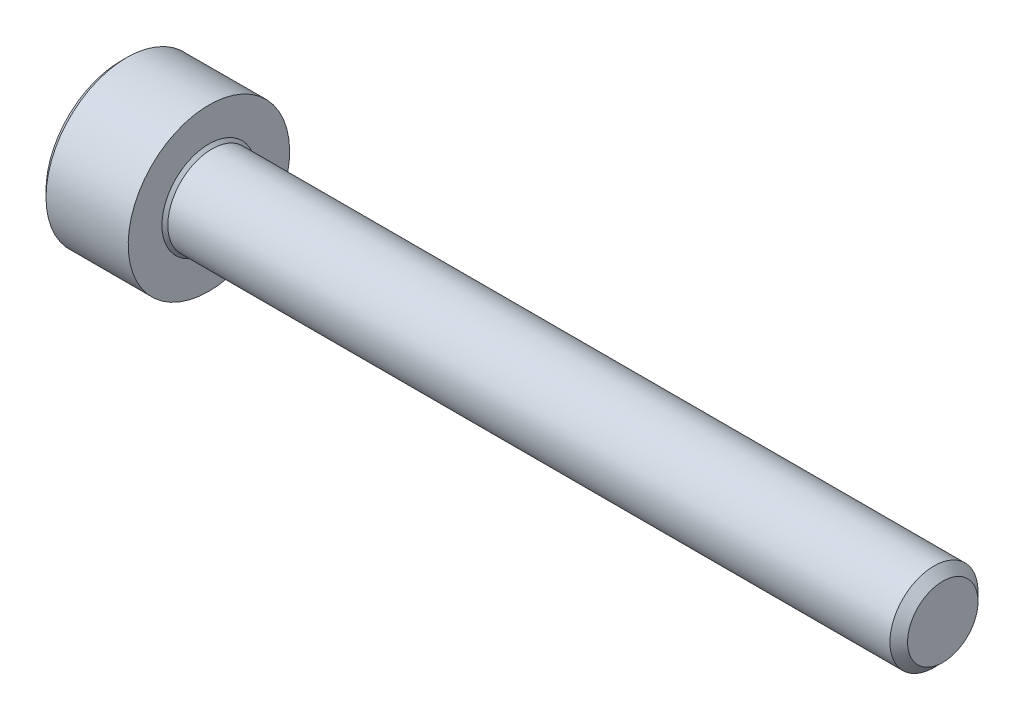
ISO-10303-21;
HEADER;
FILE_DESCRIPTION(('STEP AP214'),'2;1');
FILE_NAME('part.step','',(''),(''),'','','');
FILE_SCHEMA(('AUTOMOTIVE_DESIGN { 1 0 10303 214 1 1 1 1 }'));
ENDSEC;
DATA;
#1=APPLICATION_CONTEXT('core data for automotive mechanical design processes');
#2=APPLICATION_PROTOCOL_DEFINITION('international standard','automotive_design',2000,#1);
#3=PRODUCT_CONTEXT('',#1,'mechanical');
#4=PRODUCT('Part','Part','',(#3));
#5=PRODUCT_RELATED_PRODUCT_CATEGORY('part','',(#4));
#6=PRODUCT_DEFINITION_FORMATION('','',#4);
#7=PRODUCT_DEFINITION_CONTEXT('part definition',#1,'design');
#8=PRODUCT_DEFINITION('design','',#6,#7);
#9=PRODUCT_DEFINITION_SHAPE('','',#8);
#10=(LENGTH_UNIT() NAMED_UNIT(*) SI_UNIT(.MILLI.,.METRE.));
#11=(NAMED_UNIT(*) PLANE_ANGLE_UNIT() SI_UNIT($,.RADIAN.));
#12=(NAMED_UNIT(*) SI_UNIT($,.STERADIAN.) SOLID_ANGLE_UNIT());
#13=UNCERTAINTY_MEASURE_WITH_UNIT(LENGTH_MEASURE(1.E-05),#10,'distance_accuracy_value','');
#14=(GEOMETRIC_REPRESENTATION_CONTEXT(3) GLOBAL_UNCERTAINTY_ASSIGNED_CONTEXT((#13)) GLOBAL_UNIT_ASSIGNED_CONTEXT((#10,
#11,#12)) REPRESENTATION_CONTEXT('',''));
#15=CARTESIAN_POINT('',(0.,0.,0.));
#16=DIRECTION('',(0.,0.,1.));
#17=DIRECTION('',(1.,0.,0.));
#18=AXIS2_PLACEMENT_3D('',#15,#16,#17);
#19=CARTESIAN_POINT('',(-25.,0.,0.));
#20=DIRECTION('',(1.,0.,0.));
#21=DIRECTION('',(0.,0.,-1.));
#22=AXIS2_PLACEMENT_3D('',#19,#20,#21);
#23=CYLINDRICAL_SURFACE('',#22,1.5);
#24=CARTESIAN_POINT('',(-24.9,0.,0.));
#25=DIRECTION('',(-1.,0.,0.));
#26=DIRECTION('',(0.,0.,1.));
#27=AXIS2_PLACEMENT_3D('',#24,#25,#26);
#28=CIRCLE('',#27,1.5);
#29=CARTESIAN_POINT('',(-24.9,0.,1.5));
#30=VERTEX_POINT('',#29);
#31=EDGE_CURVE('E55',#30,#30,#28,.F.);
#32=ORIENTED_EDGE('',*,*,#31,.T.);
#33=EDGE_LOOP('',(#32));
#34=FACE_BOUND('',#33,.T.);
#35=CARTESIAN_POINT('',(-0.300000000000002,0.,0.));
#36=DIRECTION('',(1.,0.,0.));
#37=DIRECTION('',(0.,0.,-1.));
#38=AXIS2_PLACEMENT_3D('',#35,#36,#37);
#39=CIRCLE('',#38,1.5);
#40=CARTESIAN_POINT('',(-0.300000000000002,0.,-1.5));
#41=VERTEX_POINT('',#40);
#42=EDGE_CURVE('E108',#41,#41,#39,.F.);
#43=ORIENTED_EDGE('',*,*,#42,.T.);
#44=EDGE_LOOP('',(#43));
#45=FACE_BOUND('',#44,.T.);
#46=ADVANCED_FACE('F45',(#34,#45),#23,.T.);
#47=CARTESIAN_POINT('',(0.,0.,0.));
#48=DIRECTION('',(1.,0.,0.));
#49=DIRECTION('',(0.,0.,-1.));
#50=AXIS2_PLACEMENT_3D('',#47,#48,#49);
#51=PLANE('',#50);
#52=CARTESIAN_POINT('',(0.,0.,0.));
#53=DIRECTION('',(1.,0.,0.));
#54=DIRECTION('',(0.,0.,-1.));
#55=AXIS2_PLACEMENT_3D('',#52,#53,#54);
#56=CIRCLE('',#55,1.2);
#57=CARTESIAN_POINT('',(0.,0.,-1.2));
#58=VERTEX_POINT('',#57);
#59=EDGE_CURVE('E141',#58,#58,#56,.T.);
#60=ORIENTED_EDGE('',*,*,#59,.T.);
#61=EDGE_LOOP('',(#60));
#62=FACE_BOUND('',#61,.T.);
#63=ADVANCED_FACE('F220',(#62),#51,.T.);
#64=CARTESIAN_POINT('',(0.,0.,0.));
#65=DIRECTION('',(-1.,0.,0.));
#66=DIRECTION('',(0.,0.,1.));
#67=AXIS2_PLACEMENT_3D('',#64,#65,#66);
#68=CONICAL_SURFACE('',#67,1.2,0.785398163397452);
#69=ORIENTED_EDGE('',*,*,#42,.F.);
#70=EDGE_LOOP('',(#69));
#71=FACE_BOUND('',#70,.T.);
#72=ORIENTED_EDGE('',*,*,#59,.F.);
#73=EDGE_LOOP('',(#72));
#74=FACE_BOUND('',#73,.T.);
#75=ADVANCED_FACE('F228',(#71,#74),#68,.T.);
#76=CARTESIAN_POINT('',(-28.,0.,0.));
#77=DIRECTION('',(1.,0.,0.));
#78=DIRECTION('',(0.,1.,0.));
#79=AXIS2_PLACEMENT_3D('',#76,#77,#78);
#80=PLANE('',#79);
#81=CARTESIAN_POINT('',(-28.,0.,0.));
#82=DIRECTION('',(1.,0.,0.));
#83=DIRECTION('',(0.,1.,0.));
#84=AXIS2_PLACEMENT_3D('',#81,#82,#83);
#85=CIRCLE('',#84,2.55);
#86=CARTESIAN_POINT('',(-28.,2.55000000000001,0.));
#87=VERTEX_POINT('',#86);
#88=EDGE_CURVE('E107',#87,#87,#85,.F.);
#89=ORIENTED_EDGE('',*,*,#88,.T.);
#90=EDGE_LOOP('',(#89));
#91=FACE_BOUND('',#90,.T.);
#92=CARTESIAN_POINT('',(-28.,0.,0.));
#93=DIRECTION('',(-1.,0.,0.));
#94=DIRECTION('',(0.,-1.,0.));
#95=AXIS2_PLACEMENT_3D('',#92,#93,#94);
#96=CIRCLE('',#95,1.49337567297408);
#97=CARTESIAN_POINT('',(-28.,-1.493375672974,0.));
#98=VERTEX_POINT('',#97);
#99=EDGE_CURVE('E282',#98,#98,#96,.T.);
#100=ORIENTED_EDGE('',*,*,#99,.F.);
#101=EDGE_LOOP('',(#100));
#102=FACE_BOUND('',#101,.T.);
#103=ADVANCED_FACE('F236',(#91,#102),#80,.F.);
#104=CARTESIAN_POINT('',(-25.,0.,0.));
#105=DIRECTION('',(-1.,0.,0.));
#106=DIRECTION('',(0.,-1.,0.));
#107=AXIS2_PLACEMENT_3D('',#104,#105,#106);
#108=CYLINDRICAL_SURFACE('',#107,2.75);
#109=CARTESIAN_POINT('',(-27.8,0.,0.));
#110=DIRECTION('',(1.,0.,0.));
#111=DIRECTION('',(0.,1.,0.));
#112=AXIS2_PLACEMENT_3D('',#109,#110,#111);
#113=CIRCLE('',#112,2.75);
#114=CARTESIAN_POINT('',(-27.8,2.75,0.));
#115=VERTEX_POINT('',#114);
#116=EDGE_CURVE('E252',#115,#115,#113,.T.);
#117=ORIENTED_EDGE('',*,*,#116,.T.);
#118=EDGE_LOOP('',(#117));
#119=FACE_BOUND('',#118,.T.);
#120=CARTESIAN_POINT('',(-25.,0.,0.));
#121=DIRECTION('',(-1.,0.,0.));
#122=DIRECTION('',(0.,-1.,0.));
#123=AXIS2_PLACEMENT_3D('',#120,#121,#122);
#124=CIRCLE('',#123,2.75);
#125=CARTESIAN_POINT('',(-25.,-2.75,0.));
#126=VERTEX_POINT('',#125);
#127=EDGE_CURVE('E138',#126,#126,#124,.T.);
#128=ORIENTED_EDGE('',*,*,#127,.T.);
#129=EDGE_LOOP('',(#128));
#130=FACE_BOUND('',#129,.T.);
#131=ADVANCED_FACE('F266',(#119,#130),#108,.T.);
#132=CARTESIAN_POINT('',(-25.,2.75,0.));
#133=DIRECTION('',(-1.,0.,0.));
#134=DIRECTION('',(0.,-1.,0.));
#135=AXIS2_PLACEMENT_3D('',#132,#133,#134);
#136=PLANE('',#135);
#137=CARTESIAN_POINT('',(-25.,0.,0.));
#138=DIRECTION('',(-1.,0.,0.));
#139=DIRECTION('',(0.,-1.,0.));
#140=AXIS2_PLACEMENT_3D('',#137,#138,#139);
#141=CIRCLE('',#140,1.60000000000001);
#142=CARTESIAN_POINT('',(-25.,-1.60000000000002,0.));
#143=VERTEX_POINT('',#142);
#144=EDGE_CURVE('E11',#143,#143,#141,.T.);
#145=ORIENTED_EDGE('',*,*,#144,.T.);
#146=EDGE_LOOP('',(#145));
#147=FACE_BOUND('',#146,.T.);
#148=ORIENTED_EDGE('',*,*,#127,.F.);
#149=EDGE_LOOP('',(#148));
#150=FACE_BOUND('',#149,.T.);
#151=ADVANCED_FACE('F162',(#147,#150),#136,.F.);
#152=CARTESIAN_POINT('',(-28.,0.,0.));
#153=DIRECTION('',(-1.,0.,0.));
#154=DIRECTION('',(0.,-1.,0.));
#155=AXIS2_PLACEMENT_3D('',#152,#153,#154);
#156=CONICAL_SURFACE('',#155,1.49337567297408,0.78539816339745);
#157=ORIENTED_EDGE('',*,*,#99,.T.);
#158=EDGE_LOOP('',(#157));
#159=FACE_BOUND('',#158,.T.);
#160=CARTESIAN_POINT('',(-28.4014021689884,-1.42396736984794,1.25));
#161=CARTESIAN_POINT('',(-28.375296136448,-1.38922450814771,1.25));
#162=CARTESIAN_POINT('',(-28.3494506563431,-1.35428640192992,1.25));
#163=CARTESIAN_POINT('',(-28.2983879120234,-1.28394100441959,1.25));
#164=CARTESIAN_POINT('',(-28.2731708093588,-1.24853359598573,1.25));
#165=CARTESIAN_POINT('',(-28.1982633539511,-1.14097140016116,1.25));
#166=CARTESIAN_POINT('',(-28.1497190435972,-1.06800495826746,1.25));
#167=CARTESIAN_POINT('',(-28.0545600162985,-0.915095472420311,1.25));
#168=CARTESIAN_POINT('',(-28.0082030382604,-0.834990154954454,1.25));
#169=CARTESIAN_POINT('',(-27.9235039270025,-0.670798348959369,1.25));
#170=CARTESIAN_POINT('',(-27.8851347978723,-0.586726487937117,1.25));
#171=CARTESIAN_POINT('',(-27.8381985020476,-0.460385334768655,1.25));
#172=CARTESIAN_POINT('',(-27.8247021207698,-0.419954113336561,1.25));
#173=CARTESIAN_POINT('',(-27.8009573074475,-0.338129031291239,1.25));
#174=CARTESIAN_POINT('',(-27.7907091035293,-0.296735103284131,1.25));
#175=CARTESIAN_POINT('',(-27.7741594663553,-0.213916243687745,1.25));
#176=CARTESIAN_POINT('',(-27.7677913385525,-0.172504848949293,1.25));
#177=CARTESIAN_POINT('',(-27.7591237196608,-0.0892560954741499,1.25));
#178=CARTESIAN_POINT('',(-27.7568235599982,-0.0474188078702576,1.25));
#179=CARTESIAN_POINT('',(-27.7564564105193,0.0348235296905497,1.25));
#180=CARTESIAN_POINT('',(-27.7582455485416,0.0752279922917267,1.25));
#181=CARTESIAN_POINT('',(-27.7656448035135,0.155687005579656,1.25));
#182=CARTESIAN_POINT('',(-27.7712556629701,0.19574148673801,1.25));
#183=CARTESIAN_POINT('',(-27.7860898151071,0.275882483894718,1.25));
#184=CARTESIAN_POINT('',(-27.7953738895404,0.315957579678822,1.25));
#185=CARTESIAN_POINT('',(-27.8170656964992,0.39523402739533,1.25));
#186=CARTESIAN_POINT('',(-27.8294731489784,0.43443545731897,1.25));
#187=CARTESIAN_POINT('',(-27.8734108304631,0.558570325397169,1.25));
#188=CARTESIAN_POINT('',(-27.9099744143289,0.641718054005991,1.25));
#189=CARTESIAN_POINT('',(-27.9912478873066,0.804100725662132,1.25));
#190=CARTESIAN_POINT('',(-28.0359871895297,0.883320183915922,1.25));
#191=CARTESIAN_POINT('',(-28.1282652286461,1.03470895505827,1.25));
#192=CARTESIAN_POINT('',(-28.1755534388818,1.10703287925043,1.25));
#193=CARTESIAN_POINT('',(-28.2486463209253,1.21358798649196,1.25));
#194=CARTESIAN_POINT('',(-28.2732664432996,1.24864609054887,1.25));
#195=CARTESIAN_POINT('',(-28.323155260131,1.31828380805654,1.25));
#196=CARTESIAN_POINT('',(-28.3484237758017,1.35286354944699,1.25));
#197=CARTESIAN_POINT('',(-28.3739610581168,1.38724419886392,1.25));
#198=B_SPLINE_CURVE_WITH_KNOTS('',3,(#160,#161,#162,#163,#164,#165,#166,#167,#168,#169,#170,
#171,#172,#173,#174,#175,#176,#177,#178,#179,#180,#181,#182,#183,#184,#185,#186,#187,#188,#189,
#190,#191,#192,#193,#194,#195,#196,#197),.UNSPECIFIED.,.F.,.F.,(4,2,2,2,2,2,2,2,2,2,2,2,2,2,2,2,
2,2,4),(0.,0.130370422461749,0.260774023229279,0.523571931962183,0.800995227642795,
1.07746514553943,1.20522972687284,1.33300327939672,1.45851355132216,1.58400319361991,
1.70514602294322,1.82631239533598,1.94957373840993,2.07282403363807,2.34451838945523,
2.61721016161586,2.87631588769063,3.00482945023601,3.13330794967363),.UNSPECIFIED.);
#199=CARTESIAN_POINT('',(-27.95,-0.721687836486955,1.25));
#200=VERTEX_POINT('',#199);
#201=CARTESIAN_POINT('',(-27.95,0.72168783648711,1.25));
#202=VERTEX_POINT('',#201);
#203=EDGE_CURVE('E116',#200,#202,#198,.T.);
#204=ORIENTED_EDGE('',*,*,#203,.F.);
#205=CARTESIAN_POINT('',(-27.9501154839091,-1.44349114302782,-0.00019999999999968));
#206=CARTESIAN_POINT('',(-27.9253216680551,-1.41867941875057,0.0427751670715872));
#207=CARTESIAN_POINT('',(-27.9019837344187,-1.39345276980735,0.0864690047459481));
#208=CARTESIAN_POINT('',(-27.8592520040845,-1.34201263554186,0.175565930841942));
#209=CARTESIAN_POINT('',(-27.8398819923604,-1.31579425481269,0.220977498357064));
#210=CARTESIAN_POINT('',(-27.8067004834135,-1.26292610442238,0.31254782093526));
#211=CARTESIAN_POINT('',(-27.7928055590526,-1.23628980770463,0.358683240175886));
#212=CARTESIAN_POINT('',(-27.7713972821606,-1.18243062538501,0.451970080407592));
#213=CARTESIAN_POINT('',(-27.7638679415668,-1.15520938653754,0.499118649136379));
#214=CARTESIAN_POINT('',(-27.7570744980507,-1.10829684367459,0.580373556887252));
#215=CARTESIAN_POINT('',(-27.7560685591043,-1.0886661725695,0.61437487662794));
#216=CARTESIAN_POINT('',(-27.7577614149113,-1.04943932800603,0.682317764432477));
#217=CARTESIAN_POINT('',(-27.7604610272155,-1.02984316311592,0.716259317655657));
#218=CARTESIAN_POINT('',(-27.7694089303164,-0.990839954603422,0.783814856457499));
#219=CARTESIAN_POINT('',(-27.7756605258997,-0.971433104248694,0.817428507286774));
#220=CARTESIAN_POINT('',(-27.7913756814139,-0.932943395609829,0.884094638217812));
#221=CARTESIAN_POINT('',(-27.8008406200874,-0.913860680098224,0.917146871030295));
#222=CARTESIAN_POINT('',(-27.8289313906876,-0.864986351354491,1.00179969160026));
#223=CARTESIAN_POINT('',(-27.8496701574522,-0.835502920148999,1.05286649242964));
#224=CARTESIAN_POINT('',(-27.8963871346715,-0.777690319475831,1.15300085411325));
#225=CARTESIAN_POINT('',(-27.9223482959468,-0.749357745598339,1.20207431157827));
#226=CARTESIAN_POINT('',(-27.9501154839091,-0.721572366433117,1.2502));
#227=B_SPLINE_CURVE_WITH_KNOTS('',3,(#205,#206,#207,#208,#209,#210,#211,#212,#213,#214,#215,
#216,#217,#218,#219,#220,#221,#222,#223,#224,#225,#226),.UNSPECIFIED.,.F.,.F.,(4,2,2,2,2,2,2,2,
2,2,4),(0.,0.166533409618301,0.334037607289761,0.498880396489697,0.663307919240273,
0.780963963458825,0.898645970148451,1.01643764860773,1.13427993171549,1.32148652032141,
1.50809158792573),.UNSPECIFIED.);
#228=CARTESIAN_POINT('',(-27.95,-1.44337567297399,0.));
#229=VERTEX_POINT('',#228);
#230=EDGE_CURVE('E184',#229,#200,#227,.T.);
#231=ORIENTED_EDGE('',*,*,#230,.F.);
#232=CARTESIAN_POINT('',(-27.9501154839091,-0.721572366433116,-1.2502));
#233=CARTESIAN_POINT('',(-27.9253216680551,-0.746384090710366,-1.20722483292841));
#234=CARTESIAN_POINT('',(-27.9019837344187,-0.771610739653586,-1.16353099525405));
#235=CARTESIAN_POINT('',(-27.8592520040845,-0.823050873919077,-1.07443406915806));
#236=CARTESIAN_POINT('',(-27.8398819923604,-0.849269254648255,-1.02902250164294));
#237=CARTESIAN_POINT('',(-27.8067004834135,-0.902137405038558,-0.937452179064741));
#238=CARTESIAN_POINT('',(-27.7928055590526,-0.92877370175631,-0.891316759824115));
#239=CARTESIAN_POINT('',(-27.7713972821606,-0.982632884075936,-0.798029919592408));
#240=CARTESIAN_POINT('',(-27.7638679415668,-1.00985412292341,-0.75088135086362));
#241=CARTESIAN_POINT('',(-27.7570744980507,-1.05676666578635,-0.669626443112747));
#242=CARTESIAN_POINT('',(-27.7560685591043,-1.07639733689144,-0.635625123372058));
#243=CARTESIAN_POINT('',(-27.7577614149113,-1.11562418145491,-0.567682235567522));
#244=CARTESIAN_POINT('',(-27.7604610272155,-1.13522034634503,-0.533740682344342));
#245=CARTESIAN_POINT('',(-27.7694089303164,-1.17422355485752,-0.466185143542499));
#246=CARTESIAN_POINT('',(-27.7756605258997,-1.19363040521225,-0.432571492713224));
#247=CARTESIAN_POINT('',(-27.7913756814139,-1.23212011385111,-0.365905361782186));
#248=CARTESIAN_POINT('',(-27.8008406200874,-1.25120282936272,-0.332853128969703));
#249=CARTESIAN_POINT('',(-27.8289313906876,-1.30007715810645,-0.248200308399735));
#250=CARTESIAN_POINT('',(-27.8496701574522,-1.32956058931194,-0.197133507570361));
#251=CARTESIAN_POINT('',(-27.8963871346715,-1.38737318998511,-0.0969991458867458));
#252=CARTESIAN_POINT('',(-27.9223482959468,-1.4157057638626,-0.0479256884217315));
#253=CARTESIAN_POINT('',(-27.9501154839091,-1.44349114302782,0.000199999999999769));
#254=B_SPLINE_CURVE_WITH_KNOTS('',3,(#232,#233,#234,#235,#236,#237,#238,#239,#240,#241,#242,
#243,#244,#245,#246,#247,#248,#249,#250,#251,#252,#253),.UNSPECIFIED.,.F.,.F.,(4,2,2,2,2,2,2,2,
2,2,4),(0.,0.166533409618304,0.334037607289763,0.498880396489698,0.663307919240276,
0.780963963458829,0.898645970148455,1.01643764860774,1.1342799317155,1.32148652032141,
1.50809158792574),.UNSPECIFIED.);
#255=CARTESIAN_POINT('',(-27.95,-0.721687836486954,-1.25));
#256=VERTEX_POINT('',#255);
#257=EDGE_CURVE('E177',#256,#229,#254,.T.);
#258=ORIENTED_EDGE('',*,*,#257,.F.);
#259=CARTESIAN_POINT('',(-28.4014021689884,-1.42396736984794,-1.25));
#260=CARTESIAN_POINT('',(-28.375296136448,-1.3892245081477,-1.25));
#261=CARTESIAN_POINT('',(-28.3494506563431,-1.35428640192992,-1.25));
#262=CARTESIAN_POINT('',(-28.2983879120234,-1.28394100441958,-1.25));
#263=CARTESIAN_POINT('',(-28.2731708093588,-1.24853359598572,-1.25));
#264=CARTESIAN_POINT('',(-28.1982633539511,-1.14097140016115,-1.25));
#265=CARTESIAN_POINT('',(-28.1497190435972,-1.06800495826746,-1.25));
#266=CARTESIAN_POINT('',(-28.0545600162985,-0.91509547242031,-1.25));
#267=CARTESIAN_POINT('',(-28.0082030382604,-0.834990154954453,-1.25));
#268=CARTESIAN_POINT('',(-27.9235039270025,-0.670798348959368,-1.25));
#269=CARTESIAN_POINT('',(-27.8851347978723,-0.586726487937116,-1.25));
#270=CARTESIAN_POINT('',(-27.8381985020476,-0.460385334768654,-1.25));
#271=CARTESIAN_POINT('',(-27.8247021207698,-0.41995411333656,-1.25));
#272=CARTESIAN_POINT('',(-27.8009573074475,-0.338129031291238,-1.25));
#273=CARTESIAN_POINT('',(-27.7907091035293,-0.29673510328413,-1.25));
#274=CARTESIAN_POINT('',(-27.7741594663553,-0.213916243687744,-1.25));
#275=CARTESIAN_POINT('',(-27.7677913385525,-0.172504848949292,-1.25));
#276=CARTESIAN_POINT('',(-27.7591237196608,-0.0892560954741491,-1.25));
#277=CARTESIAN_POINT('',(-27.7568235599982,-0.0474188078702568,-1.25));
#278=CARTESIAN_POINT('',(-27.7564564105193,0.0348235296905505,-1.25));
#279=CARTESIAN_POINT('',(-27.7582455485416,0.0752279922917275,-1.25));
#280=CARTESIAN_POINT('',(-27.7656448035135,0.155687005579657,-1.25));
#281=CARTESIAN_POINT('',(-27.7712556629701,0.195741486738011,-1.25));
#282=CARTESIAN_POINT('',(-27.7860898151071,0.275882483894719,-1.25));
#283=CARTESIAN_POINT('',(-27.7953738895404,0.315957579678822,-1.25));
#284=CARTESIAN_POINT('',(-27.8170656964992,0.39523402739533,-1.25));
#285=CARTESIAN_POINT('',(-27.8294731489784,0.43443545731897,-1.25));
#286=CARTESIAN_POINT('',(-27.8734108304631,0.55857032539717,-1.25));
#287=CARTESIAN_POINT('',(-27.9099744143289,0.641718054005991,-1.25));
#288=CARTESIAN_POINT('',(-27.9912478873066,0.804100725662132,-1.25));
#289=CARTESIAN_POINT('',(-28.0359871895297,0.883320183915921,-1.25));
#290=CARTESIAN_POINT('',(-28.1282652286461,1.03470895505827,-1.25));
#291=CARTESIAN_POINT('',(-28.1755534388818,1.10703287925042,-1.25));
#292=CARTESIAN_POINT('',(-28.2486463209253,1.21358798649196,-1.25));
#293=CARTESIAN_POINT('',(-28.2732664432996,1.24864609054887,-1.25));
#294=CARTESIAN_POINT('',(-28.323155260131,1.31828380805654,-1.25));
#295=CARTESIAN_POINT('',(-28.3484237758017,1.35286354944699,-1.25));
#296=CARTESIAN_POINT('',(-28.3739610581168,1.38724419886392,-1.25));
#297=B_SPLINE_CURVE_WITH_KNOTS('',3,(#259,#260,#261,#262,#263,#264,#265,#266,#267,#268,#269,
#270,#271,#272,#273,#274,#275,#276,#277,#278,#279,#280,#281,#282,#283,#284,#285,#286,#287,#288,
#289,#290,#291,#292,#293,#294,#295,#296),.UNSPECIFIED.,.F.,.F.,(4,2,2,2,2,2,2,2,2,2,2,2,2,2,2,2,
2,2,4),(0.,0.130370422461749,0.26077402322928,0.523571931962182,0.800995227642794,
1.07746514553942,1.20522972687283,1.33300327939672,1.45851355132216,1.58400319361991,
1.70514602294322,1.82631239533598,1.94957373840993,2.07282403363807,2.34451838945522,
2.61721016161585,2.87631588769063,3.00482945023601,3.13330794967363),.UNSPECIFIED.);
#298=CARTESIAN_POINT('',(-27.95,0.721687836487111,-1.25));
#299=VERTEX_POINT('',#298);
#300=EDGE_CURVE('E62',#299,#256,#297,.F.);
#301=ORIENTED_EDGE('',*,*,#300,.F.);
#302=CARTESIAN_POINT('',(-27.9501154839091,1.44349114302798,0.000199999999999836));
#303=CARTESIAN_POINT('',(-27.9253216680551,1.41867941875073,-0.0427751670715866));
#304=CARTESIAN_POINT('',(-27.9019837344187,1.39345276980751,-0.0864690047459474));
#305=CARTESIAN_POINT('',(-27.8592520040845,1.34201263554202,-0.175565930841941));
#306=CARTESIAN_POINT('',(-27.8398819923604,1.31579425481284,-0.220977498357063));
#307=CARTESIAN_POINT('',(-27.8067004834135,1.26292610442254,-0.312547820935259));
#308=CARTESIAN_POINT('',(-27.7928055590526,1.23628980770479,-0.358683240175884));
#309=CARTESIAN_POINT('',(-27.7713972821606,1.18243062538516,-0.45197008040759));
#310=CARTESIAN_POINT('',(-27.7638679415668,1.15520938653769,-0.499118649136378));
#311=CARTESIAN_POINT('',(-27.7570744980507,1.10829684367475,-0.58037355688725));
#312=CARTESIAN_POINT('',(-27.7560685591043,1.08866617256966,-0.614374876627939));
#313=CARTESIAN_POINT('',(-27.7577614149113,1.04943932800619,-0.682317764432475));
#314=CARTESIAN_POINT('',(-27.7604610272155,1.02984316311607,-0.716259317655655));
#315=CARTESIAN_POINT('',(-27.7694089303164,0.990839954603578,-0.783814856457497));
#316=CARTESIAN_POINT('',(-27.7756605258997,0.97143310424885,-0.817428507286772));
#317=CARTESIAN_POINT('',(-27.7913756814139,0.932943395609984,-0.884094638217811));
#318=CARTESIAN_POINT('',(-27.8008406200874,0.91386068009838,-0.917146871030293));
#319=CARTESIAN_POINT('',(-27.8289313906876,0.864986351354647,-1.00179969160026));
#320=CARTESIAN_POINT('',(-27.8496701574522,0.835502920149155,-1.05286649242964));
#321=CARTESIAN_POINT('',(-27.8963871346715,0.777690319475987,-1.15300085411325));
#322=CARTESIAN_POINT('',(-27.9223482959467,0.749357745598495,-1.20207431157827));
#323=CARTESIAN_POINT('',(-27.9501154839091,0.721572366433273,-1.2502));
#324=B_SPLINE_CURVE_WITH_KNOTS('',3,(#302,#303,#304,#305,#306,#307,#308,#309,#310,#311,#312,
#313,#314,#315,#316,#317,#318,#319,#320,#321,#322,#323),.UNSPECIFIED.,.F.,.F.,(4,2,2,2,2,2,2,2,
2,2,4),(0.,0.166533409618301,0.33403760728976,0.498880396489695,0.663307919240271,
0.780963963458823,0.898645970148449,1.01643764860773,1.13427993171549,1.32148652032141,
1.50809158792573),.UNSPECIFIED.);
#325=CARTESIAN_POINT('',(-27.95,1.44337567297414,0.));
#326=VERTEX_POINT('',#325);
#327=EDGE_CURVE('E99',#326,#299,#324,.T.);
#328=ORIENTED_EDGE('',*,*,#327,.F.);
#329=CARTESIAN_POINT('',(-27.9501154839091,0.721572366433273,1.2502));
#330=CARTESIAN_POINT('',(-27.9253216680551,0.746384090710522,1.20722483292841));
#331=CARTESIAN_POINT('',(-27.9019837344187,0.771610739653742,1.16353099525405));
#332=CARTESIAN_POINT('',(-27.8592520040845,0.823050873919232,1.07443406915806));
#333=CARTESIAN_POINT('',(-27.8398819923604,0.849269254648411,1.02902250164294));
#334=CARTESIAN_POINT('',(-27.8067004834135,0.902137405038714,0.93745217906474));
#335=CARTESIAN_POINT('',(-27.7928055590526,0.928773701756465,0.891316759824114));
#336=CARTESIAN_POINT('',(-27.7713972821606,0.982632884076091,0.798029919592407));
#337=CARTESIAN_POINT('',(-27.7638679415668,1.00985412292356,0.75088135086362));
#338=CARTESIAN_POINT('',(-27.7570744980507,1.05676666578651,0.669626443112747));
#339=CARTESIAN_POINT('',(-27.7560685591043,1.0763973368916,0.635625123372059));
#340=CARTESIAN_POINT('',(-27.7577614149113,1.11562418145506,0.567682235567522));
#341=CARTESIAN_POINT('',(-27.7604610272155,1.13522034634518,0.533740682344342));
#342=CARTESIAN_POINT('',(-27.7694089303164,1.17422355485768,0.4661851435425));
#343=CARTESIAN_POINT('',(-27.7756605258997,1.1936304052124,0.432571492713225));
#344=CARTESIAN_POINT('',(-27.7913756814139,1.23212011385127,0.365905361782186));
#345=CARTESIAN_POINT('',(-27.8008406200874,1.25120282936287,0.332853128969704));
#346=CARTESIAN_POINT('',(-27.8289313906876,1.30007715810661,0.248200308399735));
#347=CARTESIAN_POINT('',(-27.8496701574522,1.3295605893121,0.197133507570362));
#348=CARTESIAN_POINT('',(-27.8963871346715,1.38737318998527,0.0969991458867465));
#349=CARTESIAN_POINT('',(-27.9223482959467,1.41570576386276,0.0479256884217325));
#350=CARTESIAN_POINT('',(-27.9501154839091,1.44349114302798,-0.000199999999998577));
#351=B_SPLINE_CURVE_WITH_KNOTS('',3,(#329,#330,#331,#332,#333,#334,#335,#336,#337,#338,#339,
#340,#341,#342,#343,#344,#345,#346,#347,#348,#349,#350),.UNSPECIFIED.,.F.,.F.,(4,2,2,2,2,2,2,2,
2,2,4),(0.,0.166533409618302,0.334037607289762,0.498880396489699,0.663307919240275,
0.780963963458827,0.898645970148453,1.01643764860773,1.13427993171549,1.32148652032141,
1.50809158792573),.UNSPECIFIED.);
#352=EDGE_CURVE('E102',#202,#326,#351,.T.);
#353=ORIENTED_EDGE('',*,*,#352,.F.);
#354=EDGE_LOOP('',(#204,#231,#258,#301,#328,#353));
#355=FACE_BOUND('',#354,.T.);
#356=ADVANCED_FACE('F101',(#159,#355),#156,.F.);
#357=CARTESIAN_POINT('',(-26.4,1.2849902020621E-13,0.));
#358=DIRECTION('',(-1.,0.,0.));
#359=DIRECTION('',(0.,-1.,0.));
#360=AXIS2_PLACEMENT_3D('',#357,#358,#359);
#361=PLANE('',#360);
#362=DIRECTION('',(0.,0.5,-0.866025403784439));
#363=VECTOR('',#362,1.);
#364=CARTESIAN_POINT('',(-26.4,0.721687836487105,1.25));
#365=LINE('',#364,#363);
#366=CARTESIAN_POINT('',(-26.4,0.721687836487105,1.25));
#367=VERTEX_POINT('',#366);
#368=CARTESIAN_POINT('',(-26.4,1.44337567297414,0.));
#369=VERTEX_POINT('',#368);
#370=EDGE_CURVE('E115',#367,#369,#365,.T.);
#371=ORIENTED_EDGE('',*,*,#370,.T.);
#372=DIRECTION('',(0.,-0.5,-0.866025403784439));
#373=VECTOR('',#372,1.);
#374=CARTESIAN_POINT('',(-26.4,1.44337567297414,0.));
#375=LINE('',#374,#373);
#376=CARTESIAN_POINT('',(-26.4,0.721687836487105,-1.25));
#377=VERTEX_POINT('',#376);
#378=EDGE_CURVE('E120',#369,#377,#375,.T.);
#379=ORIENTED_EDGE('',*,*,#378,.T.);
#380=DIRECTION('',(0.,-1.,0.));
#381=VECTOR('',#380,1.);
#382=CARTESIAN_POINT('',(-26.4,0.721687836487105,-1.25));
#383=LINE('',#382,#381);
#384=CARTESIAN_POINT('',(-26.4,-0.72168783648696,-1.25));
#385=VERTEX_POINT('',#384);
#386=EDGE_CURVE('E318',#377,#385,#383,.T.);
#387=ORIENTED_EDGE('',*,*,#386,.T.);
#388=DIRECTION('',(0.,-0.5,0.866025403784439));
#389=VECTOR('',#388,1.);
#390=CARTESIAN_POINT('',(-26.4,-0.72168783648696,-1.25));
#391=LINE('',#390,#389);
#392=CARTESIAN_POINT('',(-26.4,-1.44337567297399,0.));
#393=VERTEX_POINT('',#392);
#394=EDGE_CURVE('E315',#385,#393,#391,.T.);
#395=ORIENTED_EDGE('',*,*,#394,.T.);
#396=DIRECTION('',(0.,0.5,0.866025403784439));
#397=VECTOR('',#396,1.);
#398=CARTESIAN_POINT('',(-26.4,-1.44337567297399,0.));
#399=LINE('',#398,#397);
#400=CARTESIAN_POINT('',(-26.4,-0.721687836486961,1.25));
#401=VERTEX_POINT('',#400);
#402=EDGE_CURVE('E134',#393,#401,#399,.T.);
#403=ORIENTED_EDGE('',*,*,#402,.T.);
#404=DIRECTION('',(0.,1.,0.));
#405=VECTOR('',#404,1.);
#406=CARTESIAN_POINT('',(-26.4,-0.721687836486961,1.25));
#407=LINE('',#406,#405);
#408=EDGE_CURVE('E124',#401,#367,#407,.T.);
#409=ORIENTED_EDGE('',*,*,#408,.T.);
#410=EDGE_LOOP('',(#371,#379,#387,#395,#403,#409));
#411=FACE_BOUND('',#410,.T.);
#412=ADVANCED_FACE('F161',(#411),#361,.T.);
#413=CARTESIAN_POINT('',(-26.4,1.44337567297414,0.));
#414=DIRECTION('',(0.,0.866025403784439,-0.5));
#415=DIRECTION('',(0.,0.5,0.866025403784439));
#416=AXIS2_PLACEMENT_3D('',#413,#414,#415);
#417=PLANE('',#416);
#418=DIRECTION('',(-1.,0.,0.));
#419=VECTOR('',#418,1.);
#420=CARTESIAN_POINT('',(-26.4,1.44337567297414,0.));
#421=LINE('',#420,#419);
#422=EDGE_CURVE('E112',#369,#326,#421,.T.);
#423=ORIENTED_EDGE('',*,*,#422,.T.);
#424=ORIENTED_EDGE('',*,*,#327,.T.);
#425=DIRECTION('',(-1.,0.,0.));
#426=VECTOR('',#425,1.);
#427=CARTESIAN_POINT('',(-26.4,0.721687836487105,-1.25));
#428=LINE('',#427,#426);
#429=EDGE_CURVE('E123',#377,#299,#428,.T.);
#430=ORIENTED_EDGE('',*,*,#429,.F.);
#431=ORIENTED_EDGE('',*,*,#378,.F.);
#432=EDGE_LOOP('',(#423,#424,#430,#431));
#433=FACE_BOUND('',#432,.T.);
#434=ADVANCED_FACE('F118',(#433),#417,.F.);
#435=CARTESIAN_POINT('',(-26.4,0.721687836487105,-1.25));
#436=DIRECTION('',(0.,0.,-1.));
#437=DIRECTION('',(-1.,0.,0.));
#438=AXIS2_PLACEMENT_3D('',#435,#436,#437);
#439=PLANE('',#438);
#440=ORIENTED_EDGE('',*,*,#429,.T.);
#441=ORIENTED_EDGE('',*,*,#300,.T.);
#442=DIRECTION('',(-1.,0.,0.));
#443=VECTOR('',#442,1.);
#444=CARTESIAN_POINT('',(-26.4,-0.72168783648696,-1.25));
#445=LINE('',#444,#443);
#446=EDGE_CURVE('E130',#385,#256,#445,.T.);
#447=ORIENTED_EDGE('',*,*,#446,.F.);
#448=ORIENTED_EDGE('',*,*,#386,.F.);
#449=EDGE_LOOP('',(#440,#441,#447,#448));
#450=FACE_BOUND('',#449,.T.);
#451=ADVANCED_FACE('F211',(#450),#439,.F.);
#452=CARTESIAN_POINT('',(-26.4,-0.72168783648696,-1.25));
#453=DIRECTION('',(0.,-0.866025403784439,-0.5));
#454=DIRECTION('',(0.,0.5,-0.866025403784439));
#455=AXIS2_PLACEMENT_3D('',#452,#453,#454);
#456=PLANE('',#455);
#457=ORIENTED_EDGE('',*,*,#446,.T.);
#458=ORIENTED_EDGE('',*,*,#257,.T.);
#459=DIRECTION('',(-1.,0.,0.));
#460=VECTOR('',#459,1.);
#461=CARTESIAN_POINT('',(-26.4,-1.44337567297399,0.));
#462=LINE('',#461,#460);
#463=EDGE_CURVE('E300',#393,#229,#462,.T.);
#464=ORIENTED_EDGE('',*,*,#463,.F.);
#465=ORIENTED_EDGE('',*,*,#394,.F.);
#466=EDGE_LOOP('',(#457,#458,#464,#465));
#467=FACE_BOUND('',#466,.T.);
#468=ADVANCED_FACE('F207',(#467),#456,.F.);
#469=CARTESIAN_POINT('',(-26.4,-1.44337567297399,0.));
#470=DIRECTION('',(0.,-0.866025403784439,0.5));
#471=DIRECTION('',(0.,-0.5,-0.866025403784439));
#472=AXIS2_PLACEMENT_3D('',#469,#470,#471);
#473=PLANE('',#472);
#474=ORIENTED_EDGE('',*,*,#463,.T.);
#475=ORIENTED_EDGE('',*,*,#230,.T.);
#476=DIRECTION('',(-1.,0.,0.));
#477=VECTOR('',#476,1.);
#478=CARTESIAN_POINT('',(-26.4,-0.721687836486961,1.25));
#479=LINE('',#478,#477);
#480=EDGE_CURVE('E298',#401,#200,#479,.T.);
#481=ORIENTED_EDGE('',*,*,#480,.F.);
#482=ORIENTED_EDGE('',*,*,#402,.F.);
#483=EDGE_LOOP('',(#474,#475,#481,#482));
#484=FACE_BOUND('',#483,.T.);
#485=ADVANCED_FACE('F204',(#484),#473,.F.);
#486=CARTESIAN_POINT('',(-26.4,-0.721687836486961,1.25));
#487=DIRECTION('',(0.,0.,1.));
#488=DIRECTION('',(0.,-1.,0.));
#489=AXIS2_PLACEMENT_3D('',#486,#487,#488);
#490=PLANE('',#489);
#491=ORIENTED_EDGE('',*,*,#480,.T.);
#492=ORIENTED_EDGE('',*,*,#203,.T.);
#493=DIRECTION('',(-1.,0.,0.));
#494=VECTOR('',#493,1.);
#495=CARTESIAN_POINT('',(-26.4,0.721687836487105,1.25));
#496=LINE('',#495,#494);
#497=EDGE_CURVE('E70',#367,#202,#496,.T.);
#498=ORIENTED_EDGE('',*,*,#497,.F.);
#499=ORIENTED_EDGE('',*,*,#408,.F.);
#500=EDGE_LOOP('',(#491,#492,#498,#499));
#501=FACE_BOUND('',#500,.T.);
#502=ADVANCED_FACE('F201',(#501),#490,.F.);
#503=CARTESIAN_POINT('',(-26.4,0.721687836487105,1.25));
#504=DIRECTION('',(0.,0.866025403784439,0.5));
#505=DIRECTION('',(0.,-0.5,0.866025403784439));
#506=AXIS2_PLACEMENT_3D('',#503,#504,#505);
#507=PLANE('',#506);
#508=ORIENTED_EDGE('',*,*,#497,.T.);
#509=ORIENTED_EDGE('',*,*,#352,.T.);
#510=ORIENTED_EDGE('',*,*,#422,.F.);
#511=ORIENTED_EDGE('',*,*,#370,.F.);
#512=EDGE_LOOP('',(#508,#509,#510,#511));
#513=FACE_BOUND('',#512,.T.);
#514=ADVANCED_FACE('F111',(#513),#507,.F.);
#515=CARTESIAN_POINT('',(-28.,0.,0.));
#516=DIRECTION('',(1.,0.,0.));
#517=DIRECTION('',(0.,1.,0.));
#518=AXIS2_PLACEMENT_3D('',#515,#516,#517);
#519=CONICAL_SURFACE('',#518,2.55,0.785398163397447);
#520=ORIENTED_EDGE('',*,*,#116,.F.);
#521=EDGE_LOOP('',(#520));
#522=FACE_BOUND('',#521,.T.);
#523=ORIENTED_EDGE('',*,*,#88,.F.);
#524=EDGE_LOOP('',(#523));
#525=FACE_BOUND('',#524,.T.);
#526=ADVANCED_FACE('F239',(#522,#525),#519,.T.);
#527=CARTESIAN_POINT('',(-24.9,0.,0.));
#528=DIRECTION('',(-1.,0.,0.));
#529=DIRECTION('',(0.,0.,1.));
#530=AXIS2_PLACEMENT_3D('',#527,#528,#529);
#531=CONICAL_SURFACE('',#530,1.5,0.785398163397436);
#532=ORIENTED_EDGE('',*,*,#144,.F.);
#533=EDGE_LOOP('',(#532));
#534=FACE_BOUND('',#533,.T.);
#535=ORIENTED_EDGE('',*,*,#31,.F.);
#536=EDGE_LOOP('',(#535));
#537=FACE_BOUND('',#536,.T.);
#538=ADVANCED_FACE('F48',(#534,#537),#531,.T.);
#539=CLOSED_SHELL('',(#46,#63,#75,#103,#131,#151,#356,#412,#434,#451,#468,#485,#502,#514,#526,#538));
#540=MANIFOLD_SOLID_BREP('B2',#539);
#541=ADVANCED_BREP_SHAPE_REPRESENTATION('',(#18,#540),#14);
#542=SHAPE_DEFINITION_REPRESENTATION(#9,#541);
ENDSEC;
END-ISO-10303-21;
